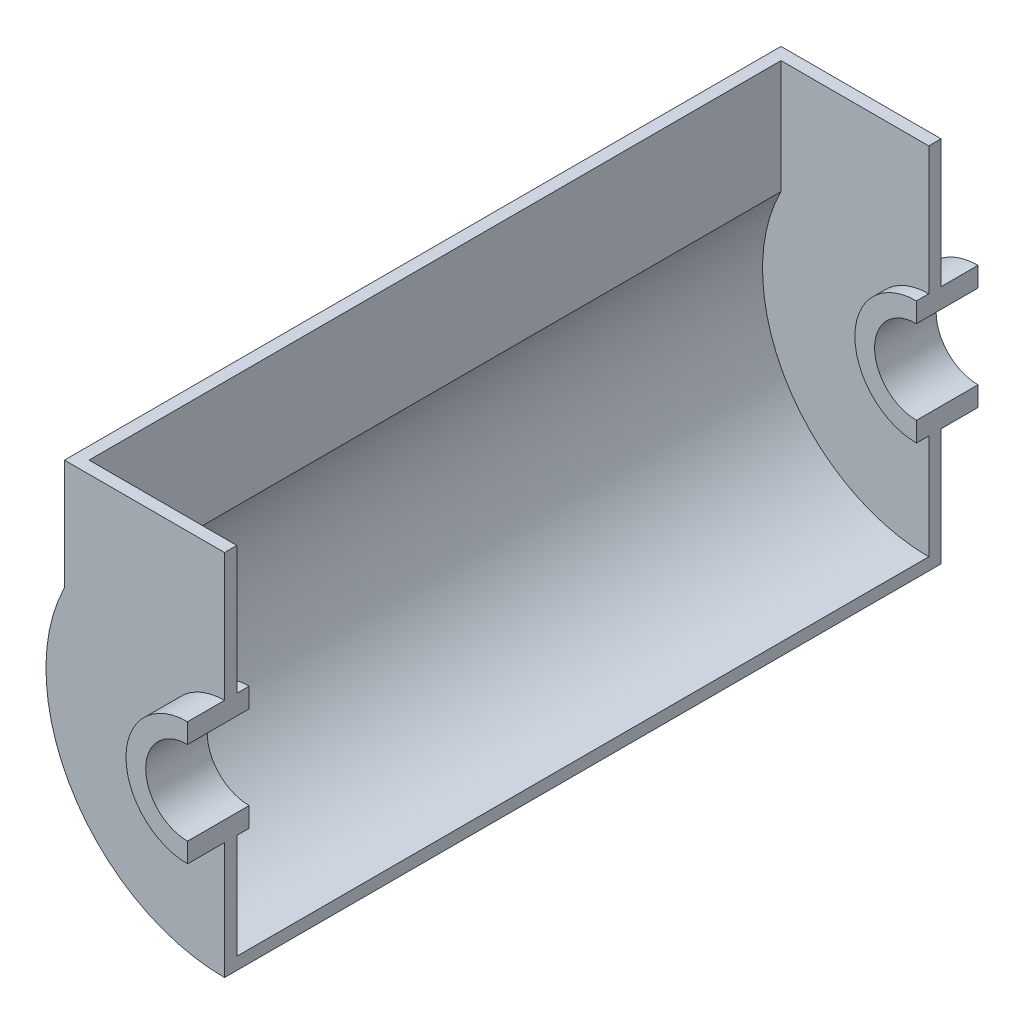
ISO-10303-21;
HEADER;
FILE_DESCRIPTION(('STEP AP214'),'2;1');
FILE_NAME('part.step','',(''),(''),'','','');
FILE_SCHEMA(('AUTOMOTIVE_DESIGN { 1 0 10303 214 1 1 1 1 }'));
ENDSEC;
DATA;
#1=APPLICATION_CONTEXT('core data for automotive mechanical design processes');
#2=APPLICATION_PROTOCOL_DEFINITION('international standard','automotive_design',2000,#1);
#3=PRODUCT_CONTEXT('',#1,'mechanical');
#4=PRODUCT('Part','Part','',(#3));
#5=PRODUCT_RELATED_PRODUCT_CATEGORY('part','',(#4));
#6=PRODUCT_DEFINITION_FORMATION('','',#4);
#7=PRODUCT_DEFINITION_CONTEXT('part definition',#1,'design');
#8=PRODUCT_DEFINITION('design','',#6,#7);
#9=PRODUCT_DEFINITION_SHAPE('','',#8);
#10=(LENGTH_UNIT() NAMED_UNIT(*) SI_UNIT(.MILLI.,.METRE.));
#11=(NAMED_UNIT(*) PLANE_ANGLE_UNIT() SI_UNIT($,.RADIAN.));
#12=(NAMED_UNIT(*) SI_UNIT($,.STERADIAN.) SOLID_ANGLE_UNIT());
#13=UNCERTAINTY_MEASURE_WITH_UNIT(LENGTH_MEASURE(1.E-05),#10,'distance_accuracy_value','');
#14=(GEOMETRIC_REPRESENTATION_CONTEXT(3) GLOBAL_UNCERTAINTY_ASSIGNED_CONTEXT((#13)) GLOBAL_UNIT_ASSIGNED_CONTEXT((#10,
#11,#12)) REPRESENTATION_CONTEXT('',''));
#15=CARTESIAN_POINT('',(0.,0.,0.));
#16=DIRECTION('',(0.,0.,1.));
#17=DIRECTION('',(1.,0.,0.));
#18=AXIS2_PLACEMENT_3D('',#15,#16,#17);
#19=CARTESIAN_POINT('',(0.,0.,0.));
#20=DIRECTION('',(0.,0.,1.));
#21=DIRECTION('',(1.,0.,0.));
#22=AXIS2_PLACEMENT_3D('',#19,#20,#21);
#23=PLANE('',#22);
#24=DIRECTION('',(0.,-1.,0.));
#25=VECTOR('',#24,1.);
#26=CARTESIAN_POINT('',(-60.,77.,0.));
#27=LINE('',#26,#25);
#28=CARTESIAN_POINT('',(-60.,77.,0.));
#29=VERTEX_POINT('',#28);
#30=CARTESIAN_POINT('',(-60.,30.9232921921324,0.));
#31=VERTEX_POINT('',#30);
#32=EDGE_CURVE('E265',#29,#31,#27,.T.);
#33=ORIENTED_EDGE('',*,*,#32,.F.);
#34=DIRECTION('',(-1.,0.,0.));
#35=VECTOR('',#34,1.);
#36=CARTESIAN_POINT('',(0.,77.,0.));
#37=LINE('',#36,#35);
#38=CARTESIAN_POINT('',(0.,77.,0.));
#39=VERTEX_POINT('',#38);
#40=EDGE_CURVE('E295',#39,#29,#37,.T.);
#41=ORIENTED_EDGE('',*,*,#40,.F.);
#42=DIRECTION('',(0.,1.,0.));
#43=VECTOR('',#42,1.);
#44=CARTESIAN_POINT('',(0.,25.,0.));
#45=LINE('',#44,#43);
#46=CARTESIAN_POINT('',(0.,25.,0.));
#47=VERTEX_POINT('',#46);
#48=EDGE_CURVE('E293',#47,#39,#45,.T.);
#49=ORIENTED_EDGE('',*,*,#48,.F.);
#50=CARTESIAN_POINT('',(0.,0.,0.));
#51=DIRECTION('',(0.,0.,-1.));
#52=DIRECTION('',(1.,0.,0.));
#53=AXIS2_PLACEMENT_3D('',#50,#51,#52);
#54=CIRCLE('',#53,25.);
#55=CARTESIAN_POINT('',(0.,-25.,0.));
#56=VERTEX_POINT('',#55);
#57=EDGE_CURVE('E271',#56,#47,#54,.T.);
#58=ORIENTED_EDGE('',*,*,#57,.F.);
#59=DIRECTION('',(0.,1.,0.));
#60=VECTOR('',#59,1.);
#61=CARTESIAN_POINT('',(0.,-25.,0.));
#62=LINE('',#61,#60);
#63=CARTESIAN_POINT('',(0.,-67.5,0.));
#64=VERTEX_POINT('',#63);
#65=EDGE_CURVE('E280',#64,#56,#62,.T.);
#66=ORIENTED_EDGE('',*,*,#65,.F.);
#67=CARTESIAN_POINT('',(0.,0.,0.));
#68=DIRECTION('',(0.,0.,1.));
#69=DIRECTION('',(-1.,0.,0.));
#70=AXIS2_PLACEMENT_3D('',#67,#68,#69);
#71=CIRCLE('',#70,67.5);
#72=EDGE_CURVE('E62',#31,#64,#71,.T.);
#73=ORIENTED_EDGE('',*,*,#72,.F.);
#74=EDGE_LOOP('',(#33,#41,#49,#58,#66,#73));
#75=FACE_BOUND('',#74,.T.);
#76=ADVANCED_FACE('F45',(#75),#23,.F.);
#77=CARTESIAN_POINT('',(0.,0.,-5.));
#78=DIRECTION('',(0.,0.,1.));
#79=DIRECTION('',(1.,0.,0.));
#80=AXIS2_PLACEMENT_3D('',#77,#78,#79);
#81=CYLINDRICAL_SURFACE('',#80,25.);
#82=DIRECTION('',(0.,0.,1.));
#83=VECTOR('',#82,1.);
#84=CARTESIAN_POINT('',(0.,-25.,-5.));
#85=LINE('',#84,#83);
#86=CARTESIAN_POINT('',(0.,-25.,-5.));
#87=VERTEX_POINT('',#86);
#88=EDGE_CURVE('E54',#87,#56,#85,.T.);
#89=ORIENTED_EDGE('',*,*,#88,.T.);
#90=ORIENTED_EDGE('',*,*,#57,.T.);
#91=DIRECTION('',(0.,0.,1.));
#92=VECTOR('',#91,1.);
#93=CARTESIAN_POINT('',(0.,25.,-5.));
#94=LINE('',#93,#92);
#95=CARTESIAN_POINT('',(0.,25.,-5.));
#96=VERTEX_POINT('',#95);
#97=EDGE_CURVE('E332',#96,#47,#94,.T.);
#98=ORIENTED_EDGE('',*,*,#97,.F.);
#99=CARTESIAN_POINT('',(0.,0.,-5.));
#100=DIRECTION('',(0.,0.,1.));
#101=DIRECTION('',(1.,0.,0.));
#102=AXIS2_PLACEMENT_3D('',#99,#100,#101);
#103=CIRCLE('',#102,25.);
#104=EDGE_CURVE('E324',#96,#87,#103,.T.);
#105=ORIENTED_EDGE('',*,*,#104,.T.);
#106=EDGE_LOOP('',(#89,#90,#98,#105));
#107=FACE_BOUND('',#106,.T.);
#108=ADVANCED_FACE('F356',(#107),#81,.T.);
#109=CARTESIAN_POINT('',(0.,0.,-5.));
#110=DIRECTION('',(0.,0.,1.));
#111=DIRECTION('',(1.,0.,0.));
#112=AXIS2_PLACEMENT_3D('',#109,#110,#111);
#113=CYLINDRICAL_SURFACE('',#112,17.);
#114=DIRECTION('',(0.,0.,1.));
#115=VECTOR('',#114,1.);
#116=CARTESIAN_POINT('',(0.,17.,-5.));
#117=LINE('',#116,#115);
#118=CARTESIAN_POINT('',(0.,17.,-5.));
#119=VERTEX_POINT('',#118);
#120=CARTESIAN_POINT('',(0.,17.,20.));
#121=VERTEX_POINT('',#120);
#122=EDGE_CURVE('E49',#119,#121,#117,.T.);
#123=ORIENTED_EDGE('',*,*,#122,.T.);
#124=CARTESIAN_POINT('',(0.,0.,20.));
#125=DIRECTION('',(0.,0.,-1.));
#126=DIRECTION('',(1.,0.,0.));
#127=AXIS2_PLACEMENT_3D('',#124,#125,#126);
#128=CIRCLE('',#127,17.);
#129=CARTESIAN_POINT('',(0.,-17.,20.));
#130=VERTEX_POINT('',#129);
#131=EDGE_CURVE('E306',#130,#121,#128,.T.);
#132=ORIENTED_EDGE('',*,*,#131,.F.);
#133=DIRECTION('',(0.,0.,1.));
#134=VECTOR('',#133,1.);
#135=CARTESIAN_POINT('',(0.,-17.,-5.));
#136=LINE('',#135,#134);
#137=CARTESIAN_POINT('',(0.,-17.,-5.));
#138=VERTEX_POINT('',#137);
#139=EDGE_CURVE('E11',#138,#130,#136,.T.);
#140=ORIENTED_EDGE('',*,*,#139,.F.);
#141=CARTESIAN_POINT('',(0.,0.,-5.));
#142=DIRECTION('',(0.,0.,-1.));
#143=DIRECTION('',(1.,0.,0.));
#144=AXIS2_PLACEMENT_3D('',#141,#142,#143);
#145=CIRCLE('',#144,17.);
#146=EDGE_CURVE('E318',#138,#119,#145,.T.);
#147=ORIENTED_EDGE('',*,*,#146,.T.);
#148=EDGE_LOOP('',(#123,#132,#140,#147));
#149=FACE_BOUND('',#148,.T.);
#150=ADVANCED_FACE('F47',(#149),#113,.F.);
#151=CARTESIAN_POINT('',(0.,-17.,-5.));
#152=DIRECTION('',(1.,0.,0.));
#153=DIRECTION('',(0.,0.,-1.));
#154=AXIS2_PLACEMENT_3D('',#151,#152,#153);
#155=PLANE('',#154);
#156=ORIENTED_EDGE('',*,*,#139,.T.);
#157=DIRECTION('',(0.,1.,0.));
#158=VECTOR('',#157,1.);
#159=CARTESIAN_POINT('',(0.,-17.,20.));
#160=LINE('',#159,#158);
#161=CARTESIAN_POINT('',(0.,-25.,20.));
#162=VERTEX_POINT('',#161);
#163=EDGE_CURVE('E315',#162,#130,#160,.T.);
#164=ORIENTED_EDGE('',*,*,#163,.F.);
#165=CARTESIAN_POINT('',(0.,-25.,5.));
#166=VERTEX_POINT('',#165);
#167=EDGE_CURVE('E331',#166,#162,#85,.T.);
#168=ORIENTED_EDGE('',*,*,#167,.F.);
#169=DIRECTION('',(0.,1.,0.));
#170=VECTOR('',#169,1.);
#171=CARTESIAN_POINT('',(0.,-25.,5.));
#172=LINE('',#171,#170);
#173=CARTESIAN_POINT('',(0.,-72.5,5.));
#174=VERTEX_POINT('',#173);
#175=EDGE_CURVE('E288',#174,#166,#172,.T.);
#176=ORIENTED_EDGE('',*,*,#175,.F.);
#177=DIRECTION('',(0.,0.,-1.));
#178=VECTOR('',#177,1.);
#179=CARTESIAN_POINT('',(0.,-72.5,5.));
#180=LINE('',#179,#178);
#181=CARTESIAN_POINT('',(0.,-72.5,-286.));
#182=VERTEX_POINT('',#181);
#183=EDGE_CURVE('E290',#174,#182,#180,.T.);
#184=ORIENTED_EDGE('',*,*,#183,.T.);
#185=DIRECTION('',(0.,1.,0.));
#186=VECTOR('',#185,1.);
#187=CARTESIAN_POINT('',(0.,-25.,-286.));
#188=LINE('',#187,#186);
#189=CARTESIAN_POINT('',(0.,-25.,-286.));
#190=VERTEX_POINT('',#189);
#191=EDGE_CURVE('E205',#182,#190,#188,.T.);
#192=ORIENTED_EDGE('',*,*,#191,.T.);
#193=DIRECTION('',(0.,0.,-1.));
#194=VECTOR('',#193,1.);
#195=CARTESIAN_POINT('',(0.,-25.,-276.));
#196=LINE('',#195,#194);
#197=CARTESIAN_POINT('',(0.,-25.,-301.));
#198=VERTEX_POINT('',#197);
#199=EDGE_CURVE('E256',#190,#198,#196,.T.);
#200=ORIENTED_EDGE('',*,*,#199,.T.);
#201=DIRECTION('',(0.,1.,0.));
#202=VECTOR('',#201,1.);
#203=CARTESIAN_POINT('',(0.,-17.,-301.));
#204=LINE('',#203,#202);
#205=CARTESIAN_POINT('',(0.,-17.,-301.));
#206=VERTEX_POINT('',#205);
#207=EDGE_CURVE('E236',#198,#206,#204,.T.);
#208=ORIENTED_EDGE('',*,*,#207,.T.);
#209=DIRECTION('',(0.,0.,-1.));
#210=VECTOR('',#209,1.);
#211=CARTESIAN_POINT('',(0.,-17.,-276.));
#212=LINE('',#211,#210);
#213=CARTESIAN_POINT('',(0.,-17.,-276.));
#214=VERTEX_POINT('',#213);
#215=EDGE_CURVE('E249',#214,#206,#212,.T.);
#216=ORIENTED_EDGE('',*,*,#215,.F.);
#217=DIRECTION('',(0.,1.,0.));
#218=VECTOR('',#217,1.);
#219=CARTESIAN_POINT('',(0.,-17.,-276.));
#220=LINE('',#219,#218);
#221=CARTESIAN_POINT('',(0.,-25.,-276.));
#222=VERTEX_POINT('',#221);
#223=EDGE_CURVE('E246',#222,#214,#220,.T.);
#224=ORIENTED_EDGE('',*,*,#223,.F.);
#225=CARTESIAN_POINT('',(0.,-25.,-281.));
#226=VERTEX_POINT('',#225);
#227=EDGE_CURVE('E253',#222,#226,#196,.T.);
#228=ORIENTED_EDGE('',*,*,#227,.T.);
#229=DIRECTION('',(0.,1.,0.));
#230=VECTOR('',#229,1.);
#231=CARTESIAN_POINT('',(0.,-25.,-281.));
#232=LINE('',#231,#230);
#233=CARTESIAN_POINT('',(0.,-67.5,-281.));
#234=VERTEX_POINT('',#233);
#235=EDGE_CURVE('E214',#234,#226,#232,.T.);
#236=ORIENTED_EDGE('',*,*,#235,.F.);
#237=DIRECTION('',(0.,0.,1.));
#238=VECTOR('',#237,1.);
#239=CARTESIAN_POINT('',(0.,-67.5,-447.152038807834));
#240=LINE('',#239,#238);
#241=EDGE_CURVE('E263',#234,#64,#240,.T.);
#242=ORIENTED_EDGE('',*,*,#241,.T.);
#243=ORIENTED_EDGE('',*,*,#65,.T.);
#244=ORIENTED_EDGE('',*,*,#88,.F.);
#245=DIRECTION('',(0.,1.,0.));
#246=VECTOR('',#245,1.);
#247=CARTESIAN_POINT('',(0.,-17.,-5.));
#248=LINE('',#247,#246);
#249=EDGE_CURVE('E327',#87,#138,#248,.T.);
#250=ORIENTED_EDGE('',*,*,#249,.T.);
#251=EDGE_LOOP('',(#156,#164,#168,#176,#184,#192,#200,#208,#216,#224,#228,#236,#242,#243,#244,#250));
#252=FACE_BOUND('',#251,.T.);
#253=ADVANCED_FACE('F349',(#252),#155,.T.);
#254=CARTESIAN_POINT('',(0.,0.,5.));
#255=DIRECTION('',(0.,0.,-1.));
#256=DIRECTION('',(1.,0.,0.));
#257=AXIS2_PLACEMENT_3D('',#254,#255,#256);
#258=CIRCLE('',#257,25.);
#259=CARTESIAN_POINT('',(0.,25.,5.));
#260=VERTEX_POINT('',#259);
#261=EDGE_CURVE('E70',#166,#260,#258,.T.);
#262=ORIENTED_EDGE('',*,*,#261,.F.);
#263=ORIENTED_EDGE('',*,*,#167,.T.);
#264=CARTESIAN_POINT('',(0.,0.,20.));
#265=DIRECTION('',(0.,0.,1.));
#266=DIRECTION('',(1.,0.,0.));
#267=AXIS2_PLACEMENT_3D('',#264,#265,#266);
#268=CIRCLE('',#267,25.);
#269=CARTESIAN_POINT('',(0.,25.,20.));
#270=VERTEX_POINT('',#269);
#271=EDGE_CURVE('E312',#270,#162,#268,.T.);
#272=ORIENTED_EDGE('',*,*,#271,.F.);
#273=EDGE_CURVE('E334',#260,#270,#94,.T.);
#274=ORIENTED_EDGE('',*,*,#273,.F.);
#275=EDGE_LOOP('',(#262,#263,#272,#274));
#276=FACE_BOUND('',#275,.T.);
#277=ADVANCED_FACE('F368',(#276),#81,.T.);
#278=CARTESIAN_POINT('',(0.,25.,-5.));
#279=DIRECTION('',(1.,0.,0.));
#280=DIRECTION('',(0.,0.,-1.));
#281=AXIS2_PLACEMENT_3D('',#278,#279,#280);
#282=PLANE('',#281);
#283=ORIENTED_EDGE('',*,*,#97,.T.);
#284=ORIENTED_EDGE('',*,*,#48,.T.);
#285=DIRECTION('',(0.,0.,-1.));
#286=VECTOR('',#285,1.);
#287=CARTESIAN_POINT('',(0.,77.,5.));
#288=LINE('',#287,#286);
#289=CARTESIAN_POINT('',(0.,77.,5.));
#290=VERTEX_POINT('',#289);
#291=EDGE_CURVE('E303',#290,#39,#288,.T.);
#292=ORIENTED_EDGE('',*,*,#291,.F.);
#293=DIRECTION('',(0.,1.,0.));
#294=VECTOR('',#293,1.);
#295=CARTESIAN_POINT('',(0.,25.,5.));
#296=LINE('',#295,#294);
#297=EDGE_CURVE('E279',#260,#290,#296,.T.);
#298=ORIENTED_EDGE('',*,*,#297,.F.);
#299=ORIENTED_EDGE('',*,*,#273,.T.);
#300=DIRECTION('',(0.,1.,0.));
#301=VECTOR('',#300,1.);
#302=CARTESIAN_POINT('',(0.,25.,20.));
#303=LINE('',#302,#301);
#304=EDGE_CURVE('E309',#121,#270,#303,.T.);
#305=ORIENTED_EDGE('',*,*,#304,.F.);
#306=ORIENTED_EDGE('',*,*,#122,.F.);
#307=DIRECTION('',(0.,1.,0.));
#308=VECTOR('',#307,1.);
#309=CARTESIAN_POINT('',(0.,25.,-5.));
#310=LINE('',#309,#308);
#311=EDGE_CURVE('E321',#119,#96,#310,.T.);
#312=ORIENTED_EDGE('',*,*,#311,.T.);
#313=EDGE_LOOP('',(#283,#284,#292,#298,#299,#305,#306,#312));
#314=FACE_BOUND('',#313,.T.);
#315=ADVANCED_FACE('F342',(#314),#282,.T.);
#316=CARTESIAN_POINT('',(0.,0.,-5.));
#317=DIRECTION('',(0.,0.,1.));
#318=DIRECTION('',(1.,0.,0.));
#319=AXIS2_PLACEMENT_3D('',#316,#317,#318);
#320=PLANE('',#319);
#321=ORIENTED_EDGE('',*,*,#146,.F.);
#322=ORIENTED_EDGE('',*,*,#249,.F.);
#323=ORIENTED_EDGE('',*,*,#104,.F.);
#324=ORIENTED_EDGE('',*,*,#311,.F.);
#325=EDGE_LOOP('',(#321,#322,#323,#324));
#326=FACE_BOUND('',#325,.T.);
#327=ADVANCED_FACE('F353',(#326),#320,.F.);
#328=CARTESIAN_POINT('',(0.,0.,20.));
#329=DIRECTION('',(0.,0.,1.));
#330=DIRECTION('',(1.,0.,0.));
#331=AXIS2_PLACEMENT_3D('',#328,#329,#330);
#332=PLANE('',#331);
#333=ORIENTED_EDGE('',*,*,#131,.T.);
#334=ORIENTED_EDGE('',*,*,#304,.T.);
#335=ORIENTED_EDGE('',*,*,#271,.T.);
#336=ORIENTED_EDGE('',*,*,#163,.T.);
#337=EDGE_LOOP('',(#333,#334,#335,#336));
#338=FACE_BOUND('',#337,.T.);
#339=ADVANCED_FACE('F345',(#338),#332,.T.);
#340=CARTESIAN_POINT('',(0.,77.,5.));
#341=DIRECTION('',(0.,-1.,0.));
#342=DIRECTION('',(1.,0.,0.));
#343=AXIS2_PLACEMENT_3D('',#340,#341,#342);
#344=PLANE('',#343);
#345=ORIENTED_EDGE('',*,*,#40,.T.);
#346=DIRECTION('',(0.,0.,1.));
#347=VECTOR('',#346,1.);
#348=CARTESIAN_POINT('',(-60.,77.,-447.152038807834));
#349=LINE('',#348,#347);
#350=CARTESIAN_POINT('',(-60.,77.,-281.));
#351=VERTEX_POINT('',#350);
#352=EDGE_CURVE('E252',#351,#29,#349,.T.);
#353=ORIENTED_EDGE('',*,*,#352,.F.);
#354=DIRECTION('',(-1.,0.,0.));
#355=VECTOR('',#354,1.);
#356=CARTESIAN_POINT('',(0.,77.,-281.));
#357=LINE('',#356,#355);
#358=CARTESIAN_POINT('',(0.,77.,-281.));
#359=VERTEX_POINT('',#358);
#360=EDGE_CURVE('E201',#359,#351,#357,.T.);
#361=ORIENTED_EDGE('',*,*,#360,.F.);
#362=DIRECTION('',(0.,0.,1.));
#363=VECTOR('',#362,1.);
#364=CARTESIAN_POINT('',(0.,77.,-286.));
#365=LINE('',#364,#363);
#366=CARTESIAN_POINT('',(0.,77.,-286.));
#367=VERTEX_POINT('',#366);
#368=EDGE_CURVE('E196',#367,#359,#365,.T.);
#369=ORIENTED_EDGE('',*,*,#368,.F.);
#370=DIRECTION('',(-1.,0.,0.));
#371=VECTOR('',#370,1.);
#372=CARTESIAN_POINT('',(0.,77.,-286.));
#373=LINE('',#372,#371);
#374=CARTESIAN_POINT('',(-65.,77.,-286.));
#375=VERTEX_POINT('',#374);
#376=EDGE_CURVE('E183',#367,#375,#373,.T.);
#377=ORIENTED_EDGE('',*,*,#376,.T.);
#378=DIRECTION('',(0.,0.,-1.));
#379=VECTOR('',#378,1.);
#380=CARTESIAN_POINT('',(-65.,77.,5.));
#381=LINE('',#380,#379);
#382=CARTESIAN_POINT('',(-65.,77.,5.));
#383=VERTEX_POINT('',#382);
#384=EDGE_CURVE('E301',#383,#375,#381,.T.);
#385=ORIENTED_EDGE('',*,*,#384,.F.);
#386=DIRECTION('',(-1.,0.,0.));
#387=VECTOR('',#386,1.);
#388=CARTESIAN_POINT('',(0.,77.,5.));
#389=LINE('',#388,#387);
#390=EDGE_CURVE('E282',#290,#383,#389,.T.);
#391=ORIENTED_EDGE('',*,*,#390,.F.);
#392=ORIENTED_EDGE('',*,*,#291,.T.);
#393=EDGE_LOOP('',(#345,#353,#361,#369,#377,#385,#391,#392));
#394=FACE_BOUND('',#393,.T.);
#395=ADVANCED_FACE('F198',(#394),#344,.F.);
#396=CARTESIAN_POINT('',(-65.,77.,5.));
#397=DIRECTION('',(1.,0.,0.));
#398=DIRECTION('',(0.,1.,0.));
#399=AXIS2_PLACEMENT_3D('',#396,#397,#398);
#400=PLANE('',#399);
#401=ORIENTED_EDGE('',*,*,#384,.T.);
#402=DIRECTION('',(0.,-1.,0.));
#403=VECTOR('',#402,1.);
#404=CARTESIAN_POINT('',(-65.,77.,-286.));
#405=LINE('',#404,#403);
#406=CARTESIAN_POINT('',(-65.,32.1130814466628,-286.));
#407=VERTEX_POINT('',#406);
#408=EDGE_CURVE('E191',#375,#407,#405,.T.);
#409=ORIENTED_EDGE('',*,*,#408,.T.);
#410=DIRECTION('',(0.,0.,-1.));
#411=VECTOR('',#410,1.);
#412=CARTESIAN_POINT('',(-65.,32.1130814466628,5.));
#413=LINE('',#412,#411);
#414=CARTESIAN_POINT('',(-65.,32.1130814466628,5.));
#415=VERTEX_POINT('',#414);
#416=EDGE_CURVE('E299',#415,#407,#413,.T.);
#417=ORIENTED_EDGE('',*,*,#416,.F.);
#418=DIRECTION('',(0.,-1.,0.));
#419=VECTOR('',#418,1.);
#420=CARTESIAN_POINT('',(-65.,77.,5.));
#421=LINE('',#420,#419);
#422=EDGE_CURVE('E284',#383,#415,#421,.T.);
#423=ORIENTED_EDGE('',*,*,#422,.F.);
#424=EDGE_LOOP('',(#401,#409,#417,#423));
#425=FACE_BOUND('',#424,.T.);
#426=ADVANCED_FACE('F388',(#425),#400,.F.);
#427=CARTESIAN_POINT('',(0.,0.,5.));
#428=DIRECTION('',(0.,0.,-1.));
#429=DIRECTION('',(-1.,0.,0.));
#430=AXIS2_PLACEMENT_3D('',#427,#428,#429);
#431=CYLINDRICAL_SURFACE('',#430,72.5);
#432=ORIENTED_EDGE('',*,*,#416,.T.);
#433=CARTESIAN_POINT('',(0.,0.,-286.));
#434=DIRECTION('',(0.,0.,1.));
#435=DIRECTION('',(1.,0.,0.));
#436=AXIS2_PLACEMENT_3D('',#433,#434,#435);
#437=CIRCLE('',#436,72.5);
#438=EDGE_CURVE('E218',#407,#182,#437,.T.);
#439=ORIENTED_EDGE('',*,*,#438,.T.);
#440=ORIENTED_EDGE('',*,*,#183,.F.);
#441=CARTESIAN_POINT('',(0.,0.,5.));
#442=DIRECTION('',(0.,0.,1.));
#443=DIRECTION('',(1.,0.,0.));
#444=AXIS2_PLACEMENT_3D('',#441,#442,#443);
#445=CIRCLE('',#444,72.5);
#446=EDGE_CURVE('E286',#415,#174,#445,.T.);
#447=ORIENTED_EDGE('',*,*,#446,.F.);
#448=EDGE_LOOP('',(#432,#439,#440,#447));
#449=FACE_BOUND('',#448,.T.);
#450=ADVANCED_FACE('F385',(#449),#431,.T.);
#451=CARTESIAN_POINT('',(0.,0.,5.));
#452=DIRECTION('',(0.,0.,1.));
#453=DIRECTION('',(1.,0.,0.));
#454=AXIS2_PLACEMENT_3D('',#451,#452,#453);
#455=PLANE('',#454);
#456=ORIENTED_EDGE('',*,*,#261,.T.);
#457=ORIENTED_EDGE('',*,*,#297,.T.);
#458=ORIENTED_EDGE('',*,*,#390,.T.);
#459=ORIENTED_EDGE('',*,*,#422,.T.);
#460=ORIENTED_EDGE('',*,*,#446,.T.);
#461=ORIENTED_EDGE('',*,*,#175,.T.);
#462=EDGE_LOOP('',(#456,#457,#458,#459,#460,#461));
#463=FACE_BOUND('',#462,.T.);
#464=ADVANCED_FACE('F365',(#463),#455,.T.);
#465=CARTESIAN_POINT('',(-60.,77.,-447.152038807834));
#466=DIRECTION('',(-1.,0.,0.));
#467=DIRECTION('',(0.,0.,1.));
#468=AXIS2_PLACEMENT_3D('',#465,#466,#467);
#469=PLANE('',#468);
#470=DIRECTION('',(0.,-1.,0.));
#471=VECTOR('',#470,1.);
#472=CARTESIAN_POINT('',(-60.,77.,-281.));
#473=LINE('',#472,#471);
#474=CARTESIAN_POINT('',(-60.,30.9232921921324,-281.));
#475=VERTEX_POINT('',#474);
#476=EDGE_CURVE('E272',#351,#475,#473,.T.);
#477=ORIENTED_EDGE('',*,*,#476,.F.);
#478=ORIENTED_EDGE('',*,*,#352,.T.);
#479=ORIENTED_EDGE('',*,*,#32,.T.);
#480=DIRECTION('',(0.,0.,1.));
#481=VECTOR('',#480,1.);
#482=CARTESIAN_POINT('',(-60.,30.9232921921324,-447.152038807834));
#483=LINE('',#482,#481);
#484=EDGE_CURVE('E264',#475,#31,#483,.T.);
#485=ORIENTED_EDGE('',*,*,#484,.F.);
#486=EDGE_LOOP('',(#477,#478,#479,#485));
#487=FACE_BOUND('',#486,.T.);
#488=ADVANCED_FACE('F456',(#487),#469,.F.);
#489=CARTESIAN_POINT('',(0.,0.,-447.152038807834));
#490=DIRECTION('',(0.,0.,1.));
#491=DIRECTION('',(1.,0.,0.));
#492=AXIS2_PLACEMENT_3D('',#489,#490,#491);
#493=CYLINDRICAL_SURFACE('',#492,67.5);
#494=CARTESIAN_POINT('',(0.,0.,-281.));
#495=DIRECTION('',(0.,0.,-1.));
#496=DIRECTION('',(-1.,0.,0.));
#497=AXIS2_PLACEMENT_3D('',#494,#495,#496);
#498=CIRCLE('',#497,67.5);
#499=EDGE_CURVE('E268',#475,#234,#498,.F.);
#500=ORIENTED_EDGE('',*,*,#499,.F.);
#501=ORIENTED_EDGE('',*,*,#484,.T.);
#502=ORIENTED_EDGE('',*,*,#72,.T.);
#503=ORIENTED_EDGE('',*,*,#241,.F.);
#504=EDGE_LOOP('',(#500,#501,#502,#503));
#505=FACE_BOUND('',#504,.T.);
#506=ADVANCED_FACE('F468',(#505),#493,.F.);
#507=CARTESIAN_POINT('',(0.,0.,-281.));
#508=DIRECTION('',(0.,0.,-1.));
#509=DIRECTION('',(1.,0.,0.));
#510=AXIS2_PLACEMENT_3D('',#507,#508,#509);
#511=PLANE('',#510);
#512=ORIENTED_EDGE('',*,*,#360,.T.);
#513=ORIENTED_EDGE('',*,*,#476,.T.);
#514=ORIENTED_EDGE('',*,*,#499,.T.);
#515=ORIENTED_EDGE('',*,*,#235,.T.);
#516=CARTESIAN_POINT('',(0.,0.,-281.));
#517=DIRECTION('',(0.,0.,-1.));
#518=DIRECTION('',(1.,0.,0.));
#519=AXIS2_PLACEMENT_3D('',#516,#517,#518);
#520=CIRCLE('',#519,25.);
#521=CARTESIAN_POINT('',(0.,25.,-281.));
#522=VERTEX_POINT('',#521);
#523=EDGE_CURVE('E223',#226,#522,#520,.T.);
#524=ORIENTED_EDGE('',*,*,#523,.T.);
#525=DIRECTION('',(0.,1.,0.));
#526=VECTOR('',#525,1.);
#527=CARTESIAN_POINT('',(0.,25.,-281.));
#528=LINE('',#527,#526);
#529=EDGE_CURVE('E226',#522,#359,#528,.T.);
#530=ORIENTED_EDGE('',*,*,#529,.T.);
#531=EDGE_LOOP('',(#512,#513,#514,#515,#524,#530));
#532=FACE_BOUND('',#531,.T.);
#533=ADVANCED_FACE('F462',(#532),#511,.F.);
#534=CARTESIAN_POINT('',(0.,0.,-276.));
#535=DIRECTION('',(0.,0.,-1.));
#536=DIRECTION('',(1.,0.,0.));
#537=AXIS2_PLACEMENT_3D('',#534,#535,#536);
#538=CYLINDRICAL_SURFACE('',#537,25.);
#539=ORIENTED_EDGE('',*,*,#227,.F.);
#540=CARTESIAN_POINT('',(0.,0.,-276.));
#541=DIRECTION('',(0.,0.,1.));
#542=DIRECTION('',(1.,0.,0.));
#543=AXIS2_PLACEMENT_3D('',#540,#541,#542);
#544=CIRCLE('',#543,25.);
#545=CARTESIAN_POINT('',(0.,25.,-276.));
#546=VERTEX_POINT('',#545);
#547=EDGE_CURVE('E243',#546,#222,#544,.T.);
#548=ORIENTED_EDGE('',*,*,#547,.F.);
#549=DIRECTION('',(0.,0.,-1.));
#550=VECTOR('',#549,1.);
#551=CARTESIAN_POINT('',(0.,25.,-276.));
#552=LINE('',#551,#550);
#553=EDGE_CURVE('E257',#546,#522,#552,.T.);
#554=ORIENTED_EDGE('',*,*,#553,.T.);
#555=ORIENTED_EDGE('',*,*,#523,.F.);
#556=EDGE_LOOP('',(#539,#548,#554,#555));
#557=FACE_BOUND('',#556,.T.);
#558=ADVANCED_FACE('F467',(#557),#538,.T.);
#559=CARTESIAN_POINT('',(0.,0.,-276.));
#560=DIRECTION('',(0.,0.,-1.));
#561=DIRECTION('',(1.,0.,0.));
#562=AXIS2_PLACEMENT_3D('',#559,#560,#561);
#563=CYLINDRICAL_SURFACE('',#562,17.);
#564=DIRECTION('',(0.,0.,-1.));
#565=VECTOR('',#564,1.);
#566=CARTESIAN_POINT('',(0.,17.,-276.));
#567=LINE('',#566,#565);
#568=CARTESIAN_POINT('',(0.,17.,-276.));
#569=VERTEX_POINT('',#568);
#570=CARTESIAN_POINT('',(0.,17.,-301.));
#571=VERTEX_POINT('',#570);
#572=EDGE_CURVE('E248',#569,#571,#567,.T.);
#573=ORIENTED_EDGE('',*,*,#572,.F.);
#574=CARTESIAN_POINT('',(0.,0.,-276.));
#575=DIRECTION('',(0.,0.,-1.));
#576=DIRECTION('',(1.,0.,0.));
#577=AXIS2_PLACEMENT_3D('',#574,#575,#576);
#578=CIRCLE('',#577,17.);
#579=EDGE_CURVE('E238',#214,#569,#578,.T.);
#580=ORIENTED_EDGE('',*,*,#579,.F.);
#581=ORIENTED_EDGE('',*,*,#215,.T.);
#582=CARTESIAN_POINT('',(0.,0.,-301.));
#583=DIRECTION('',(0.,0.,-1.));
#584=DIRECTION('',(1.,0.,0.));
#585=AXIS2_PLACEMENT_3D('',#582,#583,#584);
#586=CIRCLE('',#585,17.);
#587=EDGE_CURVE('E204',#206,#571,#586,.T.);
#588=ORIENTED_EDGE('',*,*,#587,.T.);
#589=EDGE_LOOP('',(#573,#580,#581,#588));
#590=FACE_BOUND('',#589,.T.);
#591=ADVANCED_FACE('F477',(#590),#563,.F.);
#592=CARTESIAN_POINT('',(0.,0.,-286.));
#593=DIRECTION('',(0.,0.,-1.));
#594=DIRECTION('',(1.,0.,0.));
#595=AXIS2_PLACEMENT_3D('',#592,#593,#594);
#596=CIRCLE('',#595,25.);
#597=CARTESIAN_POINT('',(0.,25.,-286.));
#598=VERTEX_POINT('',#597);
#599=EDGE_CURVE('E212',#190,#598,#596,.T.);
#600=ORIENTED_EDGE('',*,*,#599,.T.);
#601=CARTESIAN_POINT('',(0.,25.,-301.));
#602=VERTEX_POINT('',#601);
#603=EDGE_CURVE('E210',#598,#602,#552,.T.);
#604=ORIENTED_EDGE('',*,*,#603,.T.);
#605=CARTESIAN_POINT('',(0.,0.,-301.));
#606=DIRECTION('',(0.,0.,1.));
#607=DIRECTION('',(1.,0.,0.));
#608=AXIS2_PLACEMENT_3D('',#605,#606,#607);
#609=CIRCLE('',#608,25.);
#610=EDGE_CURVE('E234',#602,#198,#609,.T.);
#611=ORIENTED_EDGE('',*,*,#610,.T.);
#612=ORIENTED_EDGE('',*,*,#199,.F.);
#613=EDGE_LOOP('',(#600,#604,#611,#612));
#614=FACE_BOUND('',#613,.T.);
#615=ADVANCED_FACE('F480',(#614),#538,.T.);
#616=CARTESIAN_POINT('',(0.,25.,-276.));
#617=DIRECTION('',(1.,0.,0.));
#618=DIRECTION('',(0.,0.,1.));
#619=AXIS2_PLACEMENT_3D('',#616,#617,#618);
#620=PLANE('',#619);
#621=ORIENTED_EDGE('',*,*,#553,.F.);
#622=DIRECTION('',(0.,1.,0.));
#623=VECTOR('',#622,1.);
#624=CARTESIAN_POINT('',(0.,25.,-276.));
#625=LINE('',#624,#623);
#626=EDGE_CURVE('E241',#569,#546,#625,.T.);
#627=ORIENTED_EDGE('',*,*,#626,.F.);
#628=ORIENTED_EDGE('',*,*,#572,.T.);
#629=DIRECTION('',(0.,1.,0.));
#630=VECTOR('',#629,1.);
#631=CARTESIAN_POINT('',(0.,25.,-301.));
#632=LINE('',#631,#630);
#633=EDGE_CURVE('E232',#571,#602,#632,.T.);
#634=ORIENTED_EDGE('',*,*,#633,.T.);
#635=ORIENTED_EDGE('',*,*,#603,.F.);
#636=DIRECTION('',(0.,1.,0.));
#637=VECTOR('',#636,1.);
#638=CARTESIAN_POINT('',(0.,25.,-286.));
#639=LINE('',#638,#637);
#640=EDGE_CURVE('E187',#598,#367,#639,.T.);
#641=ORIENTED_EDGE('',*,*,#640,.T.);
#642=ORIENTED_EDGE('',*,*,#368,.T.);
#643=ORIENTED_EDGE('',*,*,#529,.F.);
#644=EDGE_LOOP('',(#621,#627,#628,#634,#635,#641,#642,#643));
#645=FACE_BOUND('',#644,.T.);
#646=ADVANCED_FACE('F208',(#645),#620,.T.);
#647=CARTESIAN_POINT('',(0.,0.,-276.));
#648=DIRECTION('',(0.,0.,-1.));
#649=DIRECTION('',(1.,0.,0.));
#650=AXIS2_PLACEMENT_3D('',#647,#648,#649);
#651=PLANE('',#650);
#652=ORIENTED_EDGE('',*,*,#579,.T.);
#653=ORIENTED_EDGE('',*,*,#626,.T.);
#654=ORIENTED_EDGE('',*,*,#547,.T.);
#655=ORIENTED_EDGE('',*,*,#223,.T.);
#656=EDGE_LOOP('',(#652,#653,#654,#655));
#657=FACE_BOUND('',#656,.T.);
#658=ADVANCED_FACE('F499',(#657),#651,.F.);
#659=CARTESIAN_POINT('',(0.,0.,-301.));
#660=DIRECTION('',(0.,0.,-1.));
#661=DIRECTION('',(1.,0.,0.));
#662=AXIS2_PLACEMENT_3D('',#659,#660,#661);
#663=PLANE('',#662);
#664=ORIENTED_EDGE('',*,*,#587,.F.);
#665=ORIENTED_EDGE('',*,*,#207,.F.);
#666=ORIENTED_EDGE('',*,*,#610,.F.);
#667=ORIENTED_EDGE('',*,*,#633,.F.);
#668=EDGE_LOOP('',(#664,#665,#666,#667));
#669=FACE_BOUND('',#668,.T.);
#670=ADVANCED_FACE('F508',(#669),#663,.T.);
#671=CARTESIAN_POINT('',(0.,0.,-286.));
#672=DIRECTION('',(0.,0.,-1.));
#673=DIRECTION('',(1.,0.,0.));
#674=AXIS2_PLACEMENT_3D('',#671,#672,#673);
#675=PLANE('',#674);
#676=ORIENTED_EDGE('',*,*,#599,.F.);
#677=ORIENTED_EDGE('',*,*,#191,.F.);
#678=ORIENTED_EDGE('',*,*,#438,.F.);
#679=ORIENTED_EDGE('',*,*,#408,.F.);
#680=ORIENTED_EDGE('',*,*,#376,.F.);
#681=ORIENTED_EDGE('',*,*,#640,.F.);
#682=EDGE_LOOP('',(#676,#677,#678,#679,#680,#681));
#683=FACE_BOUND('',#682,.T.);
#684=ADVANCED_FACE('F185',(#683),#675,.T.);
#685=CLOSED_SHELL('',(#76,#108,#150,#253,#277,#315,#327,#339,#395,#426,#450,#464,#488,#506,#533,
#558,#591,#615,#646,#658,#670,#684));
#686=MANIFOLD_SOLID_BREP('B2',#685);
#687=ADVANCED_BREP_SHAPE_REPRESENTATION('',(#18,#686),#14);
#688=SHAPE_DEFINITION_REPRESENTATION(#9,#687);
ENDSEC;
END-ISO-10303-21;
